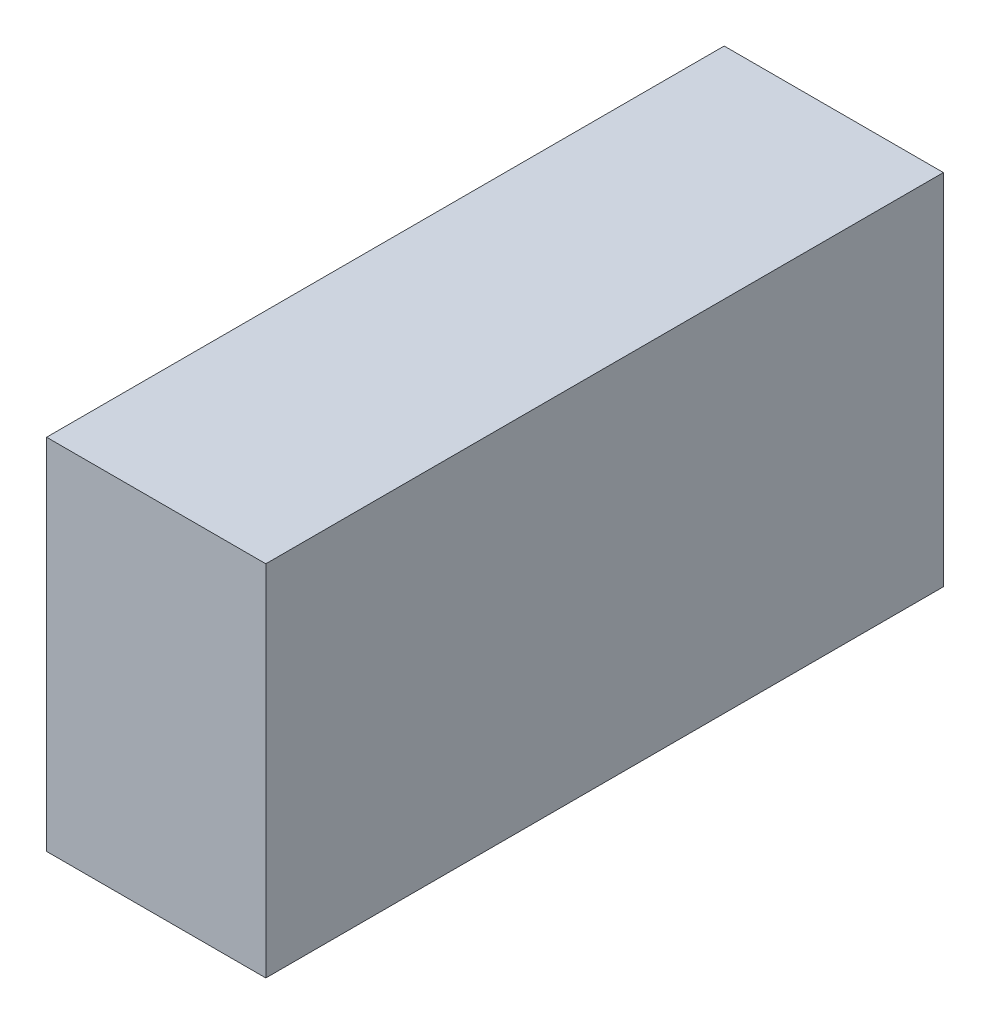
ISO-10303-21;
HEADER;
FILE_DESCRIPTION(('STEP AP214'),'2;1');
FILE_NAME('part.step','',(''),(''),'','','');
FILE_SCHEMA(('AUTOMOTIVE_DESIGN { 1 0 10303 214 1 1 1 1 }'));
ENDSEC;
DATA;
#1=APPLICATION_CONTEXT('core data for automotive mechanical design processes');
#2=APPLICATION_PROTOCOL_DEFINITION('international standard','automotive_design',2000,#1);
#3=PRODUCT_CONTEXT('',#1,'mechanical');
#4=PRODUCT('Part','Part','',(#3));
#5=PRODUCT_RELATED_PRODUCT_CATEGORY('part','',(#4));
#6=PRODUCT_DEFINITION_FORMATION('','',#4);
#7=PRODUCT_DEFINITION_CONTEXT('part definition',#1,'design');
#8=PRODUCT_DEFINITION('design','',#6,#7);
#9=PRODUCT_DEFINITION_SHAPE('','',#8);
#10=(LENGTH_UNIT() NAMED_UNIT(*) SI_UNIT(.MILLI.,.METRE.));
#11=(NAMED_UNIT(*) PLANE_ANGLE_UNIT() SI_UNIT($,.RADIAN.));
#12=(NAMED_UNIT(*) SI_UNIT($,.STERADIAN.) SOLID_ANGLE_UNIT());
#13=UNCERTAINTY_MEASURE_WITH_UNIT(LENGTH_MEASURE(1.E-05),#10,'distance_accuracy_value','');
#14=(GEOMETRIC_REPRESENTATION_CONTEXT(3) GLOBAL_UNCERTAINTY_ASSIGNED_CONTEXT((#13)) GLOBAL_UNIT_ASSIGNED_CONTEXT((#10,
#11,#12)) REPRESENTATION_CONTEXT('',''));
#15=CARTESIAN_POINT('',(0.,0.,0.));
#16=DIRECTION('',(0.,0.,1.));
#17=DIRECTION('',(1.,0.,0.));
#18=AXIS2_PLACEMENT_3D('',#15,#16,#17);
#19=CARTESIAN_POINT('',(23.,23.,-3.));
#20=DIRECTION('',(0.,0.,-1.));
#21=DIRECTION('',(-1.,0.,0.));
#22=AXIS2_PLACEMENT_3D('',#19,#20,#21);
#23=PLANE('',#22);
#24=DIRECTION('',(0.,-1.,0.));
#25=VECTOR('',#24,1.);
#26=CARTESIAN_POINT('',(12.,23.,-3.));
#27=LINE('',#26,#25);
#28=CARTESIAN_POINT('',(12.,23.,-3.));
#29=VERTEX_POINT('',#28);
#30=CARTESIAN_POINT('',(12.,5.,-3.));
#31=VERTEX_POINT('',#30);
#32=EDGE_CURVE('E104',#29,#31,#27,.T.);
#33=ORIENTED_EDGE('',*,*,#32,.T.);
#34=DIRECTION('',(-1.,0.,0.));
#35=VECTOR('',#34,1.);
#36=CARTESIAN_POINT('',(23.,5.,-3.));
#37=LINE('',#36,#35);
#38=CARTESIAN_POINT('',(23.,5.,-3.));
#39=VERTEX_POINT('',#38);
#40=EDGE_CURVE('E11',#39,#31,#37,.T.);
#41=ORIENTED_EDGE('',*,*,#40,.F.);
#42=DIRECTION('',(0.,-1.,0.));
#43=VECTOR('',#42,1.);
#44=CARTESIAN_POINT('',(23.,23.,-3.));
#45=LINE('',#44,#43);
#46=CARTESIAN_POINT('',(23.,23.,-3.));
#47=VERTEX_POINT('',#46);
#48=EDGE_CURVE('E92',#47,#39,#45,.T.);
#49=ORIENTED_EDGE('',*,*,#48,.F.);
#50=DIRECTION('',(-1.,0.,0.));
#51=VECTOR('',#50,1.);
#52=CARTESIAN_POINT('',(23.,23.,-3.));
#53=LINE('',#52,#51);
#54=EDGE_CURVE('E100',#47,#29,#53,.T.);
#55=ORIENTED_EDGE('',*,*,#54,.T.);
#56=EDGE_LOOP('',(#33,#41,#49,#55));
#57=FACE_BOUND('',#56,.T.);
#58=ADVANCED_FACE('F41',(#57),#23,.F.);
#59=CARTESIAN_POINT('',(23.,5.,-3.));
#60=DIRECTION('',(0.,1.,0.));
#61=DIRECTION('',(0.,0.,1.));
#62=AXIS2_PLACEMENT_3D('',#59,#60,#61);
#63=PLANE('',#62);
#64=DIRECTION('',(0.,0.,-1.));
#65=VECTOR('',#64,1.);
#66=CARTESIAN_POINT('',(12.,5.,-3.));
#67=LINE('',#66,#65);
#68=CARTESIAN_POINT('',(12.,5.,-37.));
#69=VERTEX_POINT('',#68);
#70=EDGE_CURVE('E96',#31,#69,#67,.T.);
#71=ORIENTED_EDGE('',*,*,#70,.T.);
#72=DIRECTION('',(-1.,0.,0.));
#73=VECTOR('',#72,1.);
#74=CARTESIAN_POINT('',(23.,5.,-37.));
#75=LINE('',#74,#73);
#76=CARTESIAN_POINT('',(23.,5.,-37.));
#77=VERTEX_POINT('',#76);
#78=EDGE_CURVE('E49',#77,#69,#75,.T.);
#79=ORIENTED_EDGE('',*,*,#78,.F.);
#80=DIRECTION('',(0.,0.,-1.));
#81=VECTOR('',#80,1.);
#82=CARTESIAN_POINT('',(23.,5.,-3.));
#83=LINE('',#82,#81);
#84=EDGE_CURVE('E87',#39,#77,#83,.T.);
#85=ORIENTED_EDGE('',*,*,#84,.F.);
#86=ORIENTED_EDGE('',*,*,#40,.T.);
#87=EDGE_LOOP('',(#71,#79,#85,#86));
#88=FACE_BOUND('',#87,.T.);
#89=ADVANCED_FACE('F95',(#88),#63,.F.);
#90=CARTESIAN_POINT('',(23.,5.,-37.));
#91=DIRECTION('',(0.,0.,1.));
#92=DIRECTION('',(1.,0.,0.));
#93=AXIS2_PLACEMENT_3D('',#90,#91,#92);
#94=PLANE('',#93);
#95=DIRECTION('',(0.,1.,0.));
#96=VECTOR('',#95,1.);
#97=CARTESIAN_POINT('',(12.,5.,-37.));
#98=LINE('',#97,#96);
#99=CARTESIAN_POINT('',(12.,23.,-37.));
#100=VERTEX_POINT('',#99);
#101=EDGE_CURVE('E74',#69,#100,#98,.T.);
#102=ORIENTED_EDGE('',*,*,#101,.T.);
#103=DIRECTION('',(-1.,0.,0.));
#104=VECTOR('',#103,1.);
#105=CARTESIAN_POINT('',(23.,23.,-37.));
#106=LINE('',#105,#104);
#107=CARTESIAN_POINT('',(23.,23.,-37.));
#108=VERTEX_POINT('',#107);
#109=EDGE_CURVE('E97',#108,#100,#106,.T.);
#110=ORIENTED_EDGE('',*,*,#109,.F.);
#111=DIRECTION('',(0.,1.,0.));
#112=VECTOR('',#111,1.);
#113=CARTESIAN_POINT('',(23.,5.,-37.));
#114=LINE('',#113,#112);
#115=EDGE_CURVE('E90',#77,#108,#114,.T.);
#116=ORIENTED_EDGE('',*,*,#115,.F.);
#117=ORIENTED_EDGE('',*,*,#78,.T.);
#118=EDGE_LOOP('',(#102,#110,#116,#117));
#119=FACE_BOUND('',#118,.T.);
#120=ADVANCED_FACE('F98',(#119),#94,.F.);
#121=CARTESIAN_POINT('',(23.,23.,-37.));
#122=DIRECTION('',(0.,-1.,0.));
#123=DIRECTION('',(0.,0.,-1.));
#124=AXIS2_PLACEMENT_3D('',#121,#122,#123);
#125=PLANE('',#124);
#126=DIRECTION('',(0.,0.,1.));
#127=VECTOR('',#126,1.);
#128=CARTESIAN_POINT('',(12.,23.,-37.));
#129=LINE('',#128,#127);
#130=EDGE_CURVE('E80',#100,#29,#129,.T.);
#131=ORIENTED_EDGE('',*,*,#130,.T.);
#132=ORIENTED_EDGE('',*,*,#54,.F.);
#133=DIRECTION('',(0.,0.,1.));
#134=VECTOR('',#133,1.);
#135=CARTESIAN_POINT('',(23.,23.,-37.));
#136=LINE('',#135,#134);
#137=EDGE_CURVE('E57',#108,#47,#136,.T.);
#138=ORIENTED_EDGE('',*,*,#137,.F.);
#139=ORIENTED_EDGE('',*,*,#109,.T.);
#140=EDGE_LOOP('',(#131,#132,#138,#139));
#141=FACE_BOUND('',#140,.T.);
#142=ADVANCED_FACE('F111',(#141),#125,.F.);
#143=CARTESIAN_POINT('',(23.,0.,0.));
#144=DIRECTION('',(1.,0.,0.));
#145=DIRECTION('',(0.,0.,-1.));
#146=AXIS2_PLACEMENT_3D('',#143,#144,#145);
#147=PLANE('',#146);
#148=ORIENTED_EDGE('',*,*,#48,.T.);
#149=ORIENTED_EDGE('',*,*,#84,.T.);
#150=ORIENTED_EDGE('',*,*,#115,.T.);
#151=ORIENTED_EDGE('',*,*,#137,.T.);
#152=EDGE_LOOP('',(#148,#149,#150,#151));
#153=FACE_BOUND('',#152,.T.);
#154=ADVANCED_FACE('F88',(#153),#147,.T.);
#155=CARTESIAN_POINT('',(12.,0.,0.));
#156=DIRECTION('',(1.,0.,0.));
#157=DIRECTION('',(0.,0.,-1.));
#158=AXIS2_PLACEMENT_3D('',#155,#156,#157);
#159=PLANE('',#158);
#160=ORIENTED_EDGE('',*,*,#32,.F.);
#161=ORIENTED_EDGE('',*,*,#130,.F.);
#162=ORIENTED_EDGE('',*,*,#101,.F.);
#163=ORIENTED_EDGE('',*,*,#70,.F.);
#164=EDGE_LOOP('',(#160,#161,#162,#163));
#165=FACE_BOUND('',#164,.T.);
#166=ADVANCED_FACE('F114',(#165),#159,.F.);
#167=CLOSED_SHELL('',(#58,#89,#120,#142,#154,#166));
#168=MANIFOLD_SOLID_BREP('B2',#167);
#169=ADVANCED_BREP_SHAPE_REPRESENTATION('',(#18,#168),#14);
#170=SHAPE_DEFINITION_REPRESENTATION(#9,#169);
ENDSEC;
END-ISO-10303-21;
